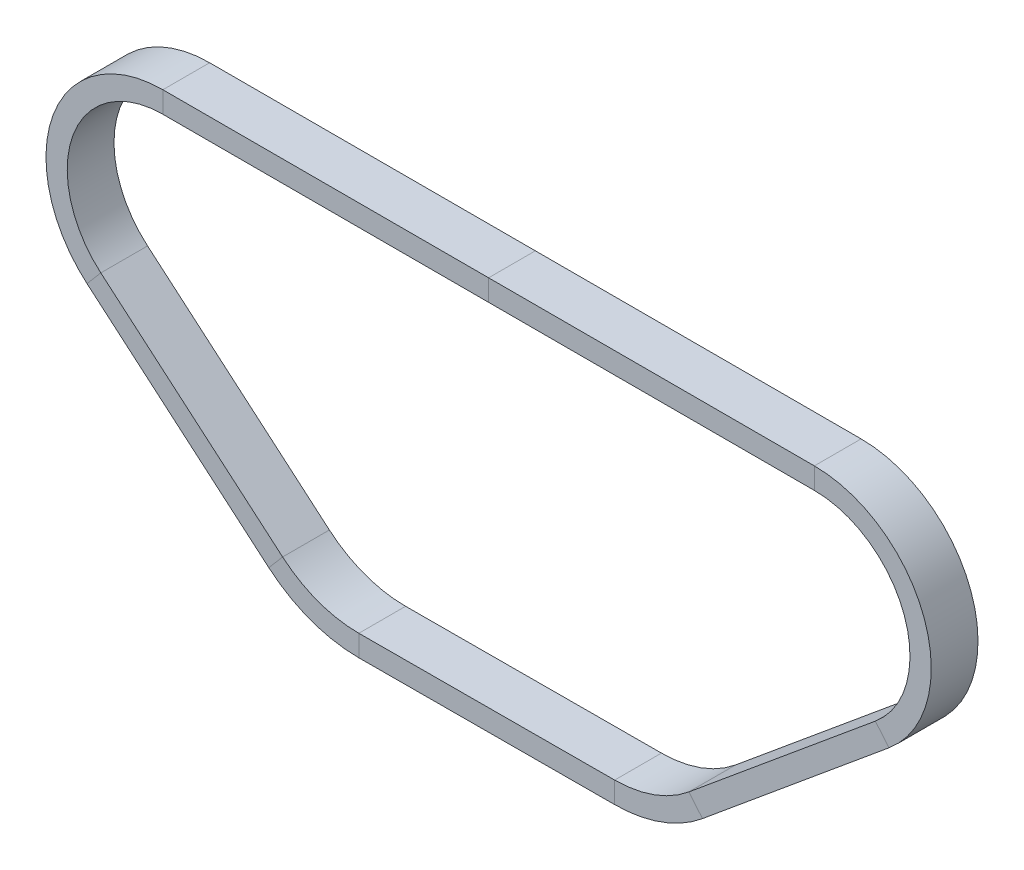
ISO-10303-21;
HEADER;
FILE_DESCRIPTION(('STEP AP214'),'2;1');
FILE_NAME('part.step','',(''),(''),'','','');
FILE_SCHEMA(('AUTOMOTIVE_DESIGN { 1 0 10303 214 1 1 1 1 }'));
ENDSEC;
DATA;
#1=APPLICATION_CONTEXT('core data for automotive mechanical design processes');
#2=APPLICATION_PROTOCOL_DEFINITION('international standard','automotive_design',2000,#1);
#3=PRODUCT_CONTEXT('',#1,'mechanical');
#4=PRODUCT('Part','Part','',(#3));
#5=PRODUCT_RELATED_PRODUCT_CATEGORY('part','',(#4));
#6=PRODUCT_DEFINITION_FORMATION('','',#4);
#7=PRODUCT_DEFINITION_CONTEXT('part definition',#1,'design');
#8=PRODUCT_DEFINITION('design','',#6,#7);
#9=PRODUCT_DEFINITION_SHAPE('','',#8);
#10=(LENGTH_UNIT() NAMED_UNIT(*) SI_UNIT(.MILLI.,.METRE.));
#11=(NAMED_UNIT(*) PLANE_ANGLE_UNIT() SI_UNIT($,.RADIAN.));
#12=(NAMED_UNIT(*) SI_UNIT($,.STERADIAN.) SOLID_ANGLE_UNIT());
#13=UNCERTAINTY_MEASURE_WITH_UNIT(LENGTH_MEASURE(1.E-05),#10,'distance_accuracy_value','');
#14=(GEOMETRIC_REPRESENTATION_CONTEXT(3) GLOBAL_UNCERTAINTY_ASSIGNED_CONTEXT((#13)) GLOBAL_UNIT_ASSIGNED_CONTEXT((#10,
#11,#12)) REPRESENTATION_CONTEXT('',''));
#15=CARTESIAN_POINT('',(0.,0.,0.));
#16=DIRECTION('',(0.,0.,1.));
#17=DIRECTION('',(1.,0.,0.));
#18=AXIS2_PLACEMENT_3D('',#15,#16,#17);
#19=CARTESIAN_POINT('',(766.320606961868,463.425171825375,55.));
#20=DIRECTION('',(0.,0.,-1.));
#21=DIRECTION('',(-1.,0.,0.));
#22=AXIS2_PLACEMENT_3D('',#19,#20,#21);
#23=PLANE('',#22);
#24=DIRECTION('',(0.,-1.,0.));
#25=VECTOR('',#24,1.);
#26=CARTESIAN_POINT('',(766.320606961868,463.425171825375,55.));
#27=LINE('',#26,#25);
#28=CARTESIAN_POINT('',(766.320606961868,463.425171825375,55.));
#29=VERTEX_POINT('',#28);
#30=CARTESIAN_POINT('',(766.320606961868,413.425171825375,55.));
#31=VERTEX_POINT('',#30);
#32=EDGE_CURVE('E215',#29,#31,#27,.T.);
#33=ORIENTED_EDGE('',*,*,#32,.F.);
#34=DIRECTION('',(-1.,0.,0.));
#35=VECTOR('',#34,1.);
#36=CARTESIAN_POINT('',(766.320606961868,463.425171825375,55.));
#37=LINE('',#36,#35);
#38=CARTESIAN_POINT('',(0.,463.425171825375,55.));
#39=VERTEX_POINT('',#38);
#40=EDGE_CURVE('E214',#29,#39,#37,.T.);
#41=ORIENTED_EDGE('',*,*,#40,.T.);
#42=DIRECTION('',(0.,-1.,0.));
#43=VECTOR('',#42,1.);
#44=CARTESIAN_POINT('',(0.,463.425171825375,55.));
#45=LINE('',#44,#43);
#46=CARTESIAN_POINT('',(0.,413.425171825375,55.));
#47=VERTEX_POINT('',#46);
#48=EDGE_CURVE('E189',#39,#47,#45,.T.);
#49=ORIENTED_EDGE('',*,*,#48,.T.);
#50=DIRECTION('',(-1.,0.,0.));
#51=VECTOR('',#50,1.);
#52=CARTESIAN_POINT('',(766.320606961868,413.425171825375,55.));
#53=LINE('',#52,#51);
#54=EDGE_CURVE('E219',#31,#47,#53,.T.);
#55=ORIENTED_EDGE('',*,*,#54,.F.);
#56=EDGE_LOOP('',(#33,#41,#49,#55));
#57=FACE_BOUND('',#56,.T.);
#58=ADVANCED_FACE('F33',(#57),#23,.F.);
#59=CARTESIAN_POINT('',(0.,463.425171825375,55.));
#60=DIRECTION('',(0.,0.,-1.));
#61=DIRECTION('',(-1.,0.,0.));
#62=AXIS2_PLACEMENT_3D('',#59,#60,#61);
#63=PLANE('',#62);
#64=DIRECTION('',(-1.,0.,0.));
#65=VECTOR('',#64,1.);
#66=CARTESIAN_POINT('',(0.,413.425171825375,55.));
#67=LINE('',#66,#65);
#68=CARTESIAN_POINT('',(-766.320606961868,413.425171825375,55.));
#69=VERTEX_POINT('',#68);
#70=EDGE_CURVE('E195',#47,#69,#67,.T.);
#71=ORIENTED_EDGE('',*,*,#70,.F.);
#72=ORIENTED_EDGE('',*,*,#48,.F.);
#73=DIRECTION('',(-1.,0.,0.));
#74=VECTOR('',#73,1.);
#75=CARTESIAN_POINT('',(0.,463.425171825375,55.));
#76=LINE('',#75,#74);
#77=CARTESIAN_POINT('',(-766.320606961868,463.425171825375,55.));
#78=VERTEX_POINT('',#77);
#79=EDGE_CURVE('E193',#39,#78,#76,.T.);
#80=ORIENTED_EDGE('',*,*,#79,.T.);
#81=DIRECTION('',(0.,-1.,0.));
#82=VECTOR('',#81,1.);
#83=CARTESIAN_POINT('',(-766.320606961868,463.425171825375,55.));
#84=LINE('',#83,#82);
#85=EDGE_CURVE('E211',#78,#69,#84,.T.);
#86=ORIENTED_EDGE('',*,*,#85,.T.);
#87=EDGE_LOOP('',(#71,#72,#80,#86));
#88=FACE_BOUND('',#87,.T.);
#89=ADVANCED_FACE('F191',(#88),#63,.F.);
#90=CARTESIAN_POINT('',(0.,413.425171825375,55.));
#91=DIRECTION('',(0.,1.,0.));
#92=DIRECTION('',(-1.,0.,0.));
#93=AXIS2_PLACEMENT_3D('',#90,#91,#92);
#94=PLANE('',#93);
#95=DIRECTION('',(-1.,0.,0.));
#96=VECTOR('',#95,1.);
#97=CARTESIAN_POINT('',(0.,413.425171825375,-55.));
#98=LINE('',#97,#96);
#99=CARTESIAN_POINT('',(0.,413.425171825375,-55.));
#100=VERTEX_POINT('',#99);
#101=CARTESIAN_POINT('',(-766.320606961868,413.425171825375,-55.));
#102=VERTEX_POINT('',#101);
#103=EDGE_CURVE('E276',#100,#102,#98,.T.);
#104=ORIENTED_EDGE('',*,*,#103,.F.);
#105=DIRECTION('',(0.,0.,-1.));
#106=VECTOR('',#105,1.);
#107=CARTESIAN_POINT('',(0.,413.425171825375,55.));
#108=LINE('',#107,#106);
#109=EDGE_CURVE('E200',#47,#100,#108,.T.);
#110=ORIENTED_EDGE('',*,*,#109,.F.);
#111=ORIENTED_EDGE('',*,*,#70,.T.);
#112=DIRECTION('',(0.,0.,-1.));
#113=VECTOR('',#112,1.);
#114=CARTESIAN_POINT('',(-766.320606961868,413.425171825375,55.));
#115=LINE('',#114,#113);
#116=EDGE_CURVE('E332',#69,#102,#115,.T.);
#117=ORIENTED_EDGE('',*,*,#116,.T.);
#118=EDGE_LOOP('',(#104,#110,#111,#117));
#119=FACE_BOUND('',#118,.T.);
#120=ADVANCED_FACE('F370',(#119),#94,.F.);
#121=CARTESIAN_POINT('',(0.,463.425171825375,-55.));
#122=DIRECTION('',(0.,0.,1.));
#123=DIRECTION('',(0.,-1.,0.));
#124=AXIS2_PLACEMENT_3D('',#121,#122,#123);
#125=PLANE('',#124);
#126=DIRECTION('',(-1.,0.,0.));
#127=VECTOR('',#126,1.);
#128=CARTESIAN_POINT('',(0.,463.425171825375,-55.));
#129=LINE('',#128,#127);
#130=CARTESIAN_POINT('',(0.,463.425171825375,-55.));
#131=VERTEX_POINT('',#130);
#132=CARTESIAN_POINT('',(-766.320606961868,463.425171825375,-55.));
#133=VERTEX_POINT('',#132);
#134=EDGE_CURVE('E230',#131,#133,#129,.T.);
#135=ORIENTED_EDGE('',*,*,#134,.F.);
#136=DIRECTION('',(0.,1.,0.));
#137=VECTOR('',#136,1.);
#138=CARTESIAN_POINT('',(0.,463.425171825375,-55.));
#139=LINE('',#138,#137);
#140=EDGE_CURVE('E222',#100,#131,#139,.T.);
#141=ORIENTED_EDGE('',*,*,#140,.F.);
#142=ORIENTED_EDGE('',*,*,#103,.T.);
#143=DIRECTION('',(0.,1.,0.));
#144=VECTOR('',#143,1.);
#145=CARTESIAN_POINT('',(-766.320606961868,463.425171825375,-55.));
#146=LINE('',#145,#144);
#147=EDGE_CURVE('E279',#102,#133,#146,.T.);
#148=ORIENTED_EDGE('',*,*,#147,.T.);
#149=EDGE_LOOP('',(#135,#141,#142,#148));
#150=FACE_BOUND('',#149,.T.);
#151=ADVANCED_FACE('F274',(#150),#125,.F.);
#152=CARTESIAN_POINT('',(0.,463.425171825375,55.));
#153=DIRECTION('',(0.,-1.,0.));
#154=DIRECTION('',(1.,0.,0.));
#155=AXIS2_PLACEMENT_3D('',#152,#153,#154);
#156=PLANE('',#155);
#157=DIRECTION('',(0.,0.,1.));
#158=VECTOR('',#157,1.);
#159=CARTESIAN_POINT('',(-766.320606961868,463.425171825375,55.));
#160=LINE('',#159,#158);
#161=EDGE_CURVE('E209',#133,#78,#160,.T.);
#162=ORIENTED_EDGE('',*,*,#161,.T.);
#163=ORIENTED_EDGE('',*,*,#79,.F.);
#164=DIRECTION('',(0.,0.,1.));
#165=VECTOR('',#164,1.);
#166=CARTESIAN_POINT('',(0.,463.425171825375,55.));
#167=LINE('',#166,#165);
#168=EDGE_CURVE('E207',#131,#39,#167,.T.);
#169=ORIENTED_EDGE('',*,*,#168,.F.);
#170=ORIENTED_EDGE('',*,*,#134,.T.);
#171=EDGE_LOOP('',(#162,#163,#169,#170));
#172=FACE_BOUND('',#171,.T.);
#173=ADVANCED_FACE('F205',(#172),#156,.F.);
#174=CARTESIAN_POINT('',(-766.320606961868,463.425171825375,55.));
#175=DIRECTION('',(0.,0.,-1.));
#176=DIRECTION('',(-1.,0.,0.));
#177=AXIS2_PLACEMENT_3D('',#174,#175,#176);
#178=PLANE('',#177);
#179=CARTESIAN_POINT('',(-766.320606961868,188.425171825375,55.));
#180=DIRECTION('',(0.,0.,1.));
#181=DIRECTION('',(0.,1.,0.));
#182=AXIS2_PLACEMENT_3D('',#179,#180,#181);
#183=CIRCLE('',#182,225.);
#184=CARTESIAN_POINT('',(-912.346371265804,17.2484322856477,55.));
#185=VERTEX_POINT('',#184);
#186=EDGE_CURVE('E338',#69,#185,#183,.T.);
#187=ORIENTED_EDGE('',*,*,#186,.F.);
#188=ORIENTED_EDGE('',*,*,#85,.F.);
#189=CARTESIAN_POINT('',(-766.320606961868,188.425171825375,55.));
#190=DIRECTION('',(0.,0.,1.));
#191=DIRECTION('',(0.,1.,0.));
#192=AXIS2_PLACEMENT_3D('',#189,#190,#191);
#193=CIRCLE('',#192,275.);
#194=CARTESIAN_POINT('',(-944.796541111123,-20.7908431676249,55.));
#195=VERTEX_POINT('',#194);
#196=EDGE_CURVE('E229',#78,#195,#193,.T.);
#197=ORIENTED_EDGE('',*,*,#196,.T.);
#198=DIRECTION('',(0.64900339690638,0.760785509065453,0.));
#199=VECTOR('',#198,1.);
#200=CARTESIAN_POINT('',(-944.796541111123,-20.7908431676249,55.));
#201=LINE('',#200,#199);
#202=EDGE_CURVE('E388',#195,#185,#201,.T.);
#203=ORIENTED_EDGE('',*,*,#202,.T.);
#204=EDGE_LOOP('',(#187,#188,#197,#203));
#205=FACE_BOUND('',#204,.T.);
#206=ADVANCED_FACE('F458',(#205),#178,.F.);
#207=CARTESIAN_POINT('',(-766.320606961868,188.425171825375,0.));
#208=DIRECTION('',(0.,0.,1.));
#209=DIRECTION('',(1.,0.,0.));
#210=AXIS2_PLACEMENT_3D('',#207,#208,#209);
#211=CYLINDRICAL_SURFACE('',#210,225.);
#212=CARTESIAN_POINT('',(-766.320606961868,188.425171825375,-55.));
#213=DIRECTION('',(0.,0.,1.));
#214=DIRECTION('',(0.,1.,0.));
#215=AXIS2_PLACEMENT_3D('',#212,#213,#214);
#216=CIRCLE('',#215,225.);
#217=CARTESIAN_POINT('',(-912.346371265804,17.2484322856477,-55.));
#218=VERTEX_POINT('',#217);
#219=EDGE_CURVE('E287',#102,#218,#216,.T.);
#220=ORIENTED_EDGE('',*,*,#219,.F.);
#221=ORIENTED_EDGE('',*,*,#116,.F.);
#222=ORIENTED_EDGE('',*,*,#186,.T.);
#223=DIRECTION('',(0.,0.,-1.));
#224=VECTOR('',#223,1.);
#225=CARTESIAN_POINT('',(-912.346371265804,17.2484322856477,55.));
#226=LINE('',#225,#224);
#227=EDGE_CURVE('E335',#185,#218,#226,.T.);
#228=ORIENTED_EDGE('',*,*,#227,.T.);
#229=EDGE_LOOP('',(#220,#221,#222,#228));
#230=FACE_BOUND('',#229,.T.);
#231=ADVANCED_FACE('F374',(#230),#211,.F.);
#232=CARTESIAN_POINT('',(-766.320606961868,463.425171825375,-55.));
#233=DIRECTION('',(0.,0.,1.));
#234=DIRECTION('',(1.,0.,0.));
#235=AXIS2_PLACEMENT_3D('',#232,#233,#234);
#236=PLANE('',#235);
#237=CARTESIAN_POINT('',(-766.320606961868,188.425171825375,-55.));
#238=DIRECTION('',(0.,0.,1.));
#239=DIRECTION('',(0.,1.,0.));
#240=AXIS2_PLACEMENT_3D('',#237,#238,#239);
#241=CIRCLE('',#240,275.);
#242=CARTESIAN_POINT('',(-944.796541111123,-20.7908431676249,-55.));
#243=VERTEX_POINT('',#242);
#244=EDGE_CURVE('E235',#133,#243,#241,.T.);
#245=ORIENTED_EDGE('',*,*,#244,.F.);
#246=ORIENTED_EDGE('',*,*,#147,.F.);
#247=ORIENTED_EDGE('',*,*,#219,.T.);
#248=DIRECTION('',(-0.64900339690638,-0.760785509065453,0.));
#249=VECTOR('',#248,1.);
#250=CARTESIAN_POINT('',(-944.796541111123,-20.7908431676249,-55.));
#251=LINE('',#250,#249);
#252=EDGE_CURVE('E284',#218,#243,#251,.T.);
#253=ORIENTED_EDGE('',*,*,#252,.T.);
#254=EDGE_LOOP('',(#245,#246,#247,#253));
#255=FACE_BOUND('',#254,.T.);
#256=ADVANCED_FACE('F378',(#255),#236,.F.);
#257=CARTESIAN_POINT('',(-766.320606961868,188.425171825375,0.));
#258=DIRECTION('',(0.,0.,1.));
#259=DIRECTION('',(1.,0.,0.));
#260=AXIS2_PLACEMENT_3D('',#257,#258,#259);
#261=CYLINDRICAL_SURFACE('',#260,275.);
#262=DIRECTION('',(0.,0.,1.));
#263=VECTOR('',#262,1.);
#264=CARTESIAN_POINT('',(-944.796541111123,-20.7908431676249,55.));
#265=LINE('',#264,#263);
#266=EDGE_CURVE('E231',#243,#195,#265,.T.);
#267=ORIENTED_EDGE('',*,*,#266,.T.);
#268=ORIENTED_EDGE('',*,*,#196,.F.);
#269=ORIENTED_EDGE('',*,*,#161,.F.);
#270=ORIENTED_EDGE('',*,*,#244,.T.);
#271=EDGE_LOOP('',(#267,#268,#269,#270));
#272=FACE_BOUND('',#271,.T.);
#273=ADVANCED_FACE('F382',(#272),#261,.T.);
#274=CARTESIAN_POINT('',(-944.796541111123,-20.7908431676249,55.));
#275=DIRECTION('',(0.,0.,-1.));
#276=DIRECTION('',(-1.,0.,0.));
#277=AXIS2_PLACEMENT_3D('',#274,#275,#276);
#278=PLANE('',#277);
#279=DIRECTION('',(0.760785509065453,-0.64900339690638,0.));
#280=VECTOR('',#279,1.);
#281=CARTESIAN_POINT('',(-912.346371265804,17.2484322856477,55.));
#282=LINE('',#281,#280);
#283=CARTESIAN_POINT('',(-484.609419585723,-347.641186818374,55.));
#284=VERTEX_POINT('',#283);
#285=EDGE_CURVE('E343',#185,#284,#282,.T.);
#286=ORIENTED_EDGE('',*,*,#285,.F.);
#287=ORIENTED_EDGE('',*,*,#202,.F.);
#288=DIRECTION('',(0.760785509065453,-0.64900339690638,0.));
#289=VECTOR('',#288,1.);
#290=CARTESIAN_POINT('',(-944.796541111123,-20.7908431676249,55.));
#291=LINE('',#290,#289);
#292=CARTESIAN_POINT('',(-517.059589431042,-385.680462271647,55.));
#293=VERTEX_POINT('',#292);
#294=EDGE_CURVE('E234',#195,#293,#291,.T.);
#295=ORIENTED_EDGE('',*,*,#294,.T.);
#296=DIRECTION('',(0.64900339690638,0.760785509065453,0.));
#297=VECTOR('',#296,1.);
#298=CARTESIAN_POINT('',(-517.059589431042,-385.680462271647,55.));
#299=LINE('',#298,#297);
#300=EDGE_CURVE('E393',#293,#284,#299,.T.);
#301=ORIENTED_EDGE('',*,*,#300,.T.);
#302=EDGE_LOOP('',(#286,#287,#295,#301));
#303=FACE_BOUND('',#302,.T.);
#304=ADVANCED_FACE('F456',(#303),#278,.F.);
#305=CARTESIAN_POINT('',(-912.346371265804,17.2484322856477,55.));
#306=DIRECTION('',(-0.64900339690638,-0.760785509065453,0.));
#307=DIRECTION('',(0.760785509065453,-0.64900339690638,0.));
#308=AXIS2_PLACEMENT_3D('',#305,#306,#307);
#309=PLANE('',#308);
#310=DIRECTION('',(0.760785509065453,-0.64900339690638,0.));
#311=VECTOR('',#310,1.);
#312=CARTESIAN_POINT('',(-912.346371265804,17.2484322856477,-55.));
#313=LINE('',#312,#311);
#314=CARTESIAN_POINT('',(-484.609419585723,-347.641186818374,-55.));
#315=VERTEX_POINT('',#314);
#316=EDGE_CURVE('E292',#218,#315,#313,.T.);
#317=ORIENTED_EDGE('',*,*,#316,.F.);
#318=ORIENTED_EDGE('',*,*,#227,.F.);
#319=ORIENTED_EDGE('',*,*,#285,.T.);
#320=DIRECTION('',(0.,0.,-1.));
#321=VECTOR('',#320,1.);
#322=CARTESIAN_POINT('',(-484.609419585723,-347.641186818374,55.));
#323=LINE('',#322,#321);
#324=EDGE_CURVE('E340',#284,#315,#323,.T.);
#325=ORIENTED_EDGE('',*,*,#324,.T.);
#326=EDGE_LOOP('',(#317,#318,#319,#325));
#327=FACE_BOUND('',#326,.T.);
#328=ADVANCED_FACE('F455',(#327),#309,.F.);
#329=CARTESIAN_POINT('',(-944.796541111123,-20.7908431676249,-55.));
#330=DIRECTION('',(0.,0.,1.));
#331=DIRECTION('',(0.,-1.,0.));
#332=AXIS2_PLACEMENT_3D('',#329,#330,#331);
#333=PLANE('',#332);
#334=DIRECTION('',(0.760785509065453,-0.64900339690638,0.));
#335=VECTOR('',#334,1.);
#336=CARTESIAN_POINT('',(-944.796541111123,-20.7908431676249,-55.));
#337=LINE('',#336,#335);
#338=CARTESIAN_POINT('',(-517.059589431042,-385.680462271647,-55.));
#339=VERTEX_POINT('',#338);
#340=EDGE_CURVE('E240',#243,#339,#337,.T.);
#341=ORIENTED_EDGE('',*,*,#340,.F.);
#342=ORIENTED_EDGE('',*,*,#252,.F.);
#343=ORIENTED_EDGE('',*,*,#316,.T.);
#344=DIRECTION('',(-0.64900339690638,-0.760785509065453,0.));
#345=VECTOR('',#344,1.);
#346=CARTESIAN_POINT('',(-517.059589431042,-385.680462271647,-55.));
#347=LINE('',#346,#345);
#348=EDGE_CURVE('E289',#315,#339,#347,.T.);
#349=ORIENTED_EDGE('',*,*,#348,.T.);
#350=EDGE_LOOP('',(#341,#342,#343,#349));
#351=FACE_BOUND('',#350,.T.);
#352=ADVANCED_FACE('F453',(#351),#333,.F.);
#353=CARTESIAN_POINT('',(-944.796541111123,-20.7908431676249,55.));
#354=DIRECTION('',(0.64900339690638,0.760785509065453,0.));
#355=DIRECTION('',(-0.760785509065453,0.64900339690638,0.));
#356=AXIS2_PLACEMENT_3D('',#353,#354,#355);
#357=PLANE('',#356);
#358=DIRECTION('',(0.,0.,1.));
#359=VECTOR('',#358,1.);
#360=CARTESIAN_POINT('',(-517.059589431042,-385.680462271647,55.));
#361=LINE('',#360,#359);
#362=EDGE_CURVE('E236',#339,#293,#361,.T.);
#363=ORIENTED_EDGE('',*,*,#362,.T.);
#364=ORIENTED_EDGE('',*,*,#294,.F.);
#365=ORIENTED_EDGE('',*,*,#266,.F.);
#366=ORIENTED_EDGE('',*,*,#340,.T.);
#367=EDGE_LOOP('',(#363,#364,#365,#366));
#368=FACE_BOUND('',#367,.T.);
#369=ADVANCED_FACE('F451',(#368),#357,.F.);
#370=CARTESIAN_POINT('',(-517.059589431042,-385.680462271647,55.));
#371=DIRECTION('',(0.,0.,-1.));
#372=DIRECTION('',(-1.,0.,0.));
#373=AXIS2_PLACEMENT_3D('',#370,#371,#372);
#374=PLANE('',#373);
#375=CARTESIAN_POINT('',(-306.133485436468,-138.425171825375,55.));
#376=DIRECTION('',(0.,0.,1.));
#377=DIRECTION('',(-0.649003396906381,-0.760785509065452,0.));
#378=AXIS2_PLACEMENT_3D('',#375,#376,#377);
#379=CIRCLE('',#378,275.);
#380=CARTESIAN_POINT('',(-305.293587218961,-413.423889224173,55.));
#381=VERTEX_POINT('',#380);
#382=EDGE_CURVE('E348',#284,#381,#379,.T.);
#383=ORIENTED_EDGE('',*,*,#382,.F.);
#384=ORIENTED_EDGE('',*,*,#300,.F.);
#385=CARTESIAN_POINT('',(-306.133485436468,-138.425171825375,55.));
#386=DIRECTION('',(0.,0.,1.));
#387=DIRECTION('',(-0.649003396906381,-0.760785509065452,0.));
#388=AXIS2_PLACEMENT_3D('',#385,#386,#387);
#389=CIRCLE('',#388,325.);
#390=CARTESIAN_POINT('',(-305.140878452141,-463.423656023955,55.));
#391=VERTEX_POINT('',#390);
#392=EDGE_CURVE('E239',#293,#391,#389,.T.);
#393=ORIENTED_EDGE('',*,*,#392,.T.);
#394=DIRECTION('',(-0.00305417533639123,0.999995335995631,0.));
#395=VECTOR('',#394,1.);
#396=CARTESIAN_POINT('',(-305.140878452141,-463.423656023955,55.));
#397=LINE('',#396,#395);
#398=EDGE_CURVE('E398',#391,#381,#397,.T.);
#399=ORIENTED_EDGE('',*,*,#398,.T.);
#400=EDGE_LOOP('',(#383,#384,#393,#399));
#401=FACE_BOUND('',#400,.T.);
#402=ADVANCED_FACE('F447',(#401),#374,.F.);
#403=CARTESIAN_POINT('',(-306.133485436468,-138.425171825375,0.));
#404=DIRECTION('',(0.,0.,1.));
#405=DIRECTION('',(1.,0.,0.));
#406=AXIS2_PLACEMENT_3D('',#403,#404,#405);
#407=CYLINDRICAL_SURFACE('',#406,275.);
#408=CARTESIAN_POINT('',(-306.133485436468,-138.425171825375,-55.));
#409=DIRECTION('',(0.,0.,1.));
#410=DIRECTION('',(-0.649003396906381,-0.760785509065452,0.));
#411=AXIS2_PLACEMENT_3D('',#408,#409,#410);
#412=CIRCLE('',#411,275.);
#413=CARTESIAN_POINT('',(-305.293587218961,-413.423889224173,-55.));
#414=VERTEX_POINT('',#413);
#415=EDGE_CURVE('E297',#315,#414,#412,.T.);
#416=ORIENTED_EDGE('',*,*,#415,.F.);
#417=ORIENTED_EDGE('',*,*,#324,.F.);
#418=ORIENTED_EDGE('',*,*,#382,.T.);
#419=DIRECTION('',(0.,0.,-1.));
#420=VECTOR('',#419,1.);
#421=CARTESIAN_POINT('',(-305.293587218961,-413.423889224173,55.));
#422=LINE('',#421,#420);
#423=EDGE_CURVE('E345',#381,#414,#422,.T.);
#424=ORIENTED_EDGE('',*,*,#423,.T.);
#425=EDGE_LOOP('',(#416,#417,#418,#424));
#426=FACE_BOUND('',#425,.T.);
#427=ADVANCED_FACE('F443',(#426),#407,.F.);
#428=CARTESIAN_POINT('',(-517.059589431042,-385.680462271647,-55.));
#429=DIRECTION('',(0.,0.,1.));
#430=DIRECTION('',(1.,0.,0.));
#431=AXIS2_PLACEMENT_3D('',#428,#429,#430);
#432=PLANE('',#431);
#433=CARTESIAN_POINT('',(-306.133485436468,-138.425171825375,-55.));
#434=DIRECTION('',(0.,0.,1.));
#435=DIRECTION('',(-0.649003396906381,-0.760785509065452,0.));
#436=AXIS2_PLACEMENT_3D('',#433,#434,#435);
#437=CIRCLE('',#436,325.);
#438=CARTESIAN_POINT('',(-305.140878452141,-463.423656023955,-55.));
#439=VERTEX_POINT('',#438);
#440=EDGE_CURVE('E245',#339,#439,#437,.T.);
#441=ORIENTED_EDGE('',*,*,#440,.F.);
#442=ORIENTED_EDGE('',*,*,#348,.F.);
#443=ORIENTED_EDGE('',*,*,#415,.T.);
#444=DIRECTION('',(0.00305417533639123,-0.999995335995631,0.));
#445=VECTOR('',#444,1.);
#446=CARTESIAN_POINT('',(-305.140878452141,-463.423656023955,-55.));
#447=LINE('',#446,#445);
#448=EDGE_CURVE('E294',#414,#439,#447,.T.);
#449=ORIENTED_EDGE('',*,*,#448,.T.);
#450=EDGE_LOOP('',(#441,#442,#443,#449));
#451=FACE_BOUND('',#450,.T.);
#452=ADVANCED_FACE('F439',(#451),#432,.F.);
#453=CARTESIAN_POINT('',(-306.133485436468,-138.425171825375,0.));
#454=DIRECTION('',(0.,0.,1.));
#455=DIRECTION('',(1.,0.,0.));
#456=AXIS2_PLACEMENT_3D('',#453,#454,#455);
#457=CYLINDRICAL_SURFACE('',#456,325.);
#458=DIRECTION('',(0.,0.,1.));
#459=VECTOR('',#458,1.);
#460=CARTESIAN_POINT('',(-305.140878452141,-463.423656023955,55.));
#461=LINE('',#460,#459);
#462=EDGE_CURVE('E241',#439,#391,#461,.T.);
#463=ORIENTED_EDGE('',*,*,#462,.T.);
#464=ORIENTED_EDGE('',*,*,#392,.F.);
#465=ORIENTED_EDGE('',*,*,#362,.F.);
#466=ORIENTED_EDGE('',*,*,#440,.T.);
#467=EDGE_LOOP('',(#463,#464,#465,#466));
#468=FACE_BOUND('',#467,.T.);
#469=ADVANCED_FACE('F434',(#468),#457,.T.);
#470=CARTESIAN_POINT('',(-305.140878452141,-463.423656023955,55.));
#471=DIRECTION('',(0.,0.,-1.));
#472=DIRECTION('',(-1.,0.,0.));
#473=AXIS2_PLACEMENT_3D('',#470,#471,#472);
#474=PLANE('',#473);
#475=DIRECTION('',(0.999995335995631,0.0030541753363919,0.));
#476=VECTOR('',#475,1.);
#477=CARTESIAN_POINT('',(-305.293587218961,-413.423889224173,55.));
#478=LINE('',#477,#476);
#479=CARTESIAN_POINT('',(296.584695505146,-411.58563884396,55.));
#480=VERTEX_POINT('',#479);
#481=EDGE_CURVE('E353',#381,#480,#478,.T.);
#482=ORIENTED_EDGE('',*,*,#481,.F.);
#483=ORIENTED_EDGE('',*,*,#398,.F.);
#484=DIRECTION('',(0.999995335995631,0.0030541753363919,0.));
#485=VECTOR('',#484,1.);
#486=CARTESIAN_POINT('',(-305.140878452141,-463.423656023955,55.));
#487=LINE('',#486,#485);
#488=CARTESIAN_POINT('',(296.737404271965,-461.585405643741,55.));
#489=VERTEX_POINT('',#488);
#490=EDGE_CURVE('E244',#391,#489,#487,.T.);
#491=ORIENTED_EDGE('',*,*,#490,.T.);
#492=DIRECTION('',(-0.00305417533639168,0.999995335995631,0.));
#493=VECTOR('',#492,1.);
#494=CARTESIAN_POINT('',(296.737404271965,-461.585405643741,55.));
#495=LINE('',#494,#493);
#496=EDGE_CURVE('E304',#489,#480,#495,.T.);
#497=ORIENTED_EDGE('',*,*,#496,.T.);
#498=EDGE_LOOP('',(#482,#483,#491,#497));
#499=FACE_BOUND('',#498,.T.);
#500=ADVANCED_FACE('F428',(#499),#474,.F.);
#501=CARTESIAN_POINT('',(-305.293587218961,-413.423889224173,55.));
#502=DIRECTION('',(0.0030541753363919,-0.999995335995631,0.));
#503=DIRECTION('',(0.999995335995631,0.0030541753363919,0.));
#504=AXIS2_PLACEMENT_3D('',#501,#502,#503);
#505=PLANE('',#504);
#506=DIRECTION('',(0.999995335995631,0.0030541753363919,0.));
#507=VECTOR('',#506,1.);
#508=CARTESIAN_POINT('',(-305.293587218961,-413.423889224173,-55.));
#509=LINE('',#508,#507);
#510=CARTESIAN_POINT('',(296.584695505146,-411.58563884396,-55.));
#511=VERTEX_POINT('',#510);
#512=EDGE_CURVE('E305',#414,#511,#509,.T.);
#513=ORIENTED_EDGE('',*,*,#512,.F.);
#514=ORIENTED_EDGE('',*,*,#423,.F.);
#515=ORIENTED_EDGE('',*,*,#481,.T.);
#516=DIRECTION('',(0.,0.,-1.));
#517=VECTOR('',#516,1.);
#518=CARTESIAN_POINT('',(296.584695505146,-411.58563884396,55.));
#519=LINE('',#518,#517);
#520=EDGE_CURVE('E301',#480,#511,#519,.T.);
#521=ORIENTED_EDGE('',*,*,#520,.T.);
#522=EDGE_LOOP('',(#513,#514,#515,#521));
#523=FACE_BOUND('',#522,.T.);
#524=ADVANCED_FACE('F424',(#523),#505,.F.);
#525=CARTESIAN_POINT('',(-305.140878452141,-463.423656023955,-55.));
#526=DIRECTION('',(0.,0.,1.));
#527=DIRECTION('',(0.,-1.,0.));
#528=AXIS2_PLACEMENT_3D('',#525,#526,#527);
#529=PLANE('',#528);
#530=DIRECTION('',(0.999995335995631,0.0030541753363919,0.));
#531=VECTOR('',#530,1.);
#532=CARTESIAN_POINT('',(-305.140878452141,-463.423656023955,-55.));
#533=LINE('',#532,#531);
#534=CARTESIAN_POINT('',(296.737404271965,-461.585405643741,-55.));
#535=VERTEX_POINT('',#534);
#536=EDGE_CURVE('E302',#439,#535,#533,.T.);
#537=ORIENTED_EDGE('',*,*,#536,.F.);
#538=ORIENTED_EDGE('',*,*,#448,.F.);
#539=ORIENTED_EDGE('',*,*,#512,.T.);
#540=DIRECTION('',(0.00305417533639168,-0.999995335995631,0.));
#541=VECTOR('',#540,1.);
#542=CARTESIAN_POINT('',(296.737404271965,-461.585405643741,-55.));
#543=LINE('',#542,#541);
#544=EDGE_CURVE('E250',#511,#535,#543,.T.);
#545=ORIENTED_EDGE('',*,*,#544,.T.);
#546=EDGE_LOOP('',(#537,#538,#539,#545));
#547=FACE_BOUND('',#546,.T.);
#548=ADVANCED_FACE('F418',(#547),#529,.F.);
#549=CARTESIAN_POINT('',(-305.140878452141,-463.423656023955,55.));
#550=DIRECTION('',(-0.0030541753363919,0.999995335995631,0.));
#551=DIRECTION('',(-0.999995335995631,-0.0030541753363919,0.));
#552=AXIS2_PLACEMENT_3D('',#549,#550,#551);
#553=PLANE('',#552);
#554=DIRECTION('',(0.,0.,1.));
#555=VECTOR('',#554,1.);
#556=CARTESIAN_POINT('',(296.737404271965,-461.585405643741,55.));
#557=LINE('',#556,#555);
#558=EDGE_CURVE('E246',#535,#489,#557,.T.);
#559=ORIENTED_EDGE('',*,*,#558,.T.);
#560=ORIENTED_EDGE('',*,*,#490,.F.);
#561=ORIENTED_EDGE('',*,*,#462,.F.);
#562=ORIENTED_EDGE('',*,*,#536,.T.);
#563=EDGE_LOOP('',(#559,#560,#561,#562));
#564=FACE_BOUND('',#563,.T.);
#565=ADVANCED_FACE('F431',(#564),#553,.F.);
#566=CARTESIAN_POINT('',(296.737404271965,-461.585405643741,55.));
#567=DIRECTION('',(0.,0.,-1.));
#568=DIRECTION('',(-1.,0.,0.));
#569=AXIS2_PLACEMENT_3D('',#566,#567,#568);
#570=PLANE('',#569);
#571=CARTESIAN_POINT('',(295.744797287638,-136.586921445161,55.));
#572=DIRECTION('',(0.,0.,1.));
#573=DIRECTION('',(0.00305417533639138,-0.999995335995631,0.));
#574=AXIS2_PLACEMENT_3D('',#571,#572,#573);
#575=CIRCLE('',#574,275.);
#576=CARTESIAN_POINT('',(471.211063423808,-348.333443136146,55.));
#577=VERTEX_POINT('',#576);
#578=EDGE_CURVE('E158',#480,#577,#575,.T.);
#579=ORIENTED_EDGE('',*,*,#578,.F.);
#580=ORIENTED_EDGE('',*,*,#496,.F.);
#581=CARTESIAN_POINT('',(295.744797287638,-136.586921445161,55.));
#582=DIRECTION('',(0.,0.,1.));
#583=DIRECTION('',(0.00305417533639133,-0.999995335995631,0.));
#584=AXIS2_PLACEMENT_3D('',#581,#582,#583);
#585=CIRCLE('',#584,325.);
#586=CARTESIAN_POINT('',(503.114020903112,-386.832810716325,55.));
#587=VERTEX_POINT('',#586);
#588=EDGE_CURVE('E249',#489,#587,#585,.T.);
#589=ORIENTED_EDGE('',*,*,#588,.T.);
#590=DIRECTION('',(-0.638059149586072,0.769987351603582,0.));
#591=VECTOR('',#590,1.);
#592=CARTESIAN_POINT('',(503.114020903112,-386.832810716325,55.));
#593=LINE('',#592,#591);
#594=EDGE_CURVE('E407',#587,#577,#593,.T.);
#595=ORIENTED_EDGE('',*,*,#594,.T.);
#596=EDGE_LOOP('',(#579,#580,#589,#595));
#597=FACE_BOUND('',#596,.T.);
#598=ADVANCED_FACE('F412',(#597),#570,.F.);
#599=CARTESIAN_POINT('',(295.744797287638,-136.586921445161,0.));
#600=DIRECTION('',(0.,0.,1.));
#601=DIRECTION('',(1.,0.,0.));
#602=AXIS2_PLACEMENT_3D('',#599,#600,#601);
#603=CYLINDRICAL_SURFACE('',#602,275.);
#604=CARTESIAN_POINT('',(295.744797287638,-136.586921445161,-55.));
#605=DIRECTION('',(0.,0.,1.));
#606=DIRECTION('',(0.00305417533639138,-0.999995335995631,0.));
#607=AXIS2_PLACEMENT_3D('',#604,#605,#606);
#608=CIRCLE('',#607,275.);
#609=CARTESIAN_POINT('',(471.211063423808,-348.333443136146,-55.));
#610=VERTEX_POINT('',#609);
#611=EDGE_CURVE('E152',#511,#610,#608,.T.);
#612=ORIENTED_EDGE('',*,*,#611,.F.);
#613=ORIENTED_EDGE('',*,*,#520,.F.);
#614=ORIENTED_EDGE('',*,*,#578,.T.);
#615=DIRECTION('',(0.,0.,-1.));
#616=VECTOR('',#615,1.);
#617=CARTESIAN_POINT('',(471.211063423808,-348.333443136146,55.));
#618=LINE('',#617,#616);
#619=EDGE_CURVE('E354',#577,#610,#618,.T.);
#620=ORIENTED_EDGE('',*,*,#619,.T.);
#621=EDGE_LOOP('',(#612,#613,#614,#620));
#622=FACE_BOUND('',#621,.T.);
#623=ADVANCED_FACE('F415',(#622),#603,.F.);
#624=CARTESIAN_POINT('',(296.737404271965,-461.585405643741,-55.));
#625=DIRECTION('',(0.,0.,1.));
#626=DIRECTION('',(1.,0.,0.));
#627=AXIS2_PLACEMENT_3D('',#624,#625,#626);
#628=PLANE('',#627);
#629=CARTESIAN_POINT('',(295.744797287638,-136.586921445161,-55.));
#630=DIRECTION('',(0.,0.,1.));
#631=DIRECTION('',(0.00305417533639133,-0.999995335995631,0.));
#632=AXIS2_PLACEMENT_3D('',#629,#630,#631);
#633=CIRCLE('',#632,325.);
#634=CARTESIAN_POINT('',(503.114020903112,-386.832810716325,-55.));
#635=VERTEX_POINT('',#634);
#636=EDGE_CURVE('E254',#535,#635,#633,.T.);
#637=ORIENTED_EDGE('',*,*,#636,.F.);
#638=ORIENTED_EDGE('',*,*,#544,.F.);
#639=ORIENTED_EDGE('',*,*,#611,.T.);
#640=DIRECTION('',(0.638059149586072,-0.769987351603582,0.));
#641=VECTOR('',#640,1.);
#642=CARTESIAN_POINT('',(503.114020903112,-386.832810716325,-55.));
#643=LINE('',#642,#641);
#644=EDGE_CURVE('E306',#610,#635,#643,.T.);
#645=ORIENTED_EDGE('',*,*,#644,.T.);
#646=EDGE_LOOP('',(#637,#638,#639,#645));
#647=FACE_BOUND('',#646,.T.);
#648=ADVANCED_FACE('F312',(#647),#628,.F.);
#649=CARTESIAN_POINT('',(295.744797287638,-136.586921445161,0.));
#650=DIRECTION('',(0.,0.,1.));
#651=DIRECTION('',(1.,0.,0.));
#652=AXIS2_PLACEMENT_3D('',#649,#650,#651);
#653=CYLINDRICAL_SURFACE('',#652,325.);
#654=DIRECTION('',(0.,0.,1.));
#655=VECTOR('',#654,1.);
#656=CARTESIAN_POINT('',(503.114020903112,-386.832810716325,55.));
#657=LINE('',#656,#655);
#658=EDGE_CURVE('E251',#635,#587,#657,.T.);
#659=ORIENTED_EDGE('',*,*,#658,.T.);
#660=ORIENTED_EDGE('',*,*,#588,.F.);
#661=ORIENTED_EDGE('',*,*,#558,.F.);
#662=ORIENTED_EDGE('',*,*,#636,.T.);
#663=EDGE_LOOP('',(#659,#660,#661,#662));
#664=FACE_BOUND('',#663,.T.);
#665=ADVANCED_FACE('F310',(#664),#653,.T.);
#666=CARTESIAN_POINT('',(503.114020903112,-386.832810716325,55.));
#667=DIRECTION('',(0.,0.,-1.));
#668=DIRECTION('',(-1.,0.,0.));
#669=AXIS2_PLACEMENT_3D('',#666,#667,#668);
#670=PLANE('',#669);
#671=DIRECTION('',(0.769987351603582,0.638059149586072,0.));
#672=VECTOR('',#671,1.);
#673=CARTESIAN_POINT('',(471.211063423808,-348.333443136146,55.));
#674=LINE('',#673,#672);
#675=CARTESIAN_POINT('',(909.883915618734,15.178017714569,55.));
#676=VERTEX_POINT('',#675);
#677=EDGE_CURVE('E123',#577,#676,#674,.T.);
#678=ORIENTED_EDGE('',*,*,#677,.F.);
#679=ORIENTED_EDGE('',*,*,#594,.F.);
#680=DIRECTION('',(0.769987351603582,0.638059149586072,0.));
#681=VECTOR('',#680,1.);
#682=CARTESIAN_POINT('',(503.114020903112,-386.832810716325,55.));
#683=LINE('',#682,#681);
#684=CARTESIAN_POINT('',(941.786873098038,-23.3213498656101,55.));
#685=VERTEX_POINT('',#684);
#686=EDGE_CURVE('E253',#587,#685,#683,.T.);
#687=ORIENTED_EDGE('',*,*,#686,.T.);
#688=DIRECTION('',(-0.638059149586072,0.769987351603582,0.));
#689=VECTOR('',#688,1.);
#690=CARTESIAN_POINT('',(941.786873098038,-23.3213498656101,55.));
#691=LINE('',#690,#689);
#692=EDGE_CURVE('E318',#685,#676,#691,.T.);
#693=ORIENTED_EDGE('',*,*,#692,.T.);
#694=EDGE_LOOP('',(#678,#679,#687,#693));
#695=FACE_BOUND('',#694,.T.);
#696=ADVANCED_FACE('F413',(#695),#670,.F.);
#697=CARTESIAN_POINT('',(471.211063423808,-348.333443136146,55.));
#698=DIRECTION('',(0.638059149586072,-0.769987351603582,0.));
#699=DIRECTION('',(0.769987351603582,0.638059149586072,0.));
#700=AXIS2_PLACEMENT_3D('',#697,#698,#699);
#701=PLANE('',#700);
#702=DIRECTION('',(0.769987351603582,0.638059149586072,0.));
#703=VECTOR('',#702,1.);
#704=CARTESIAN_POINT('',(471.211063423808,-348.333443136146,-55.));
#705=LINE('',#704,#703);
#706=CARTESIAN_POINT('',(909.883915618734,15.178017714569,-55.));
#707=VERTEX_POINT('',#706);
#708=EDGE_CURVE('E116',#610,#707,#705,.T.);
#709=ORIENTED_EDGE('',*,*,#708,.F.);
#710=ORIENTED_EDGE('',*,*,#619,.F.);
#711=ORIENTED_EDGE('',*,*,#677,.T.);
#712=DIRECTION('',(0.,0.,-1.));
#713=VECTOR('',#712,1.);
#714=CARTESIAN_POINT('',(909.883915618734,15.1780177145689,55.));
#715=LINE('',#714,#713);
#716=EDGE_CURVE('E357',#676,#707,#715,.T.);
#717=ORIENTED_EDGE('',*,*,#716,.T.);
#718=EDGE_LOOP('',(#709,#710,#711,#717));
#719=FACE_BOUND('',#718,.T.);
#720=ADVANCED_FACE('F414',(#719),#701,.F.);
#721=CARTESIAN_POINT('',(503.114020903112,-386.832810716325,-55.));
#722=DIRECTION('',(0.,0.,1.));
#723=DIRECTION('',(0.,-1.,0.));
#724=AXIS2_PLACEMENT_3D('',#721,#722,#723);
#725=PLANE('',#724);
#726=DIRECTION('',(0.769987351603582,0.638059149586072,0.));
#727=VECTOR('',#726,1.);
#728=CARTESIAN_POINT('',(503.114020903112,-386.832810716325,-55.));
#729=LINE('',#728,#727);
#730=CARTESIAN_POINT('',(941.786873098038,-23.3213498656101,-55.));
#731=VERTEX_POINT('',#730);
#732=EDGE_CURVE('E107',#635,#731,#729,.T.);
#733=ORIENTED_EDGE('',*,*,#732,.F.);
#734=ORIENTED_EDGE('',*,*,#644,.F.);
#735=ORIENTED_EDGE('',*,*,#708,.T.);
#736=DIRECTION('',(0.638059149586072,-0.769987351603582,0.));
#737=VECTOR('',#736,1.);
#738=CARTESIAN_POINT('',(941.786873098038,-23.3213498656101,-55.));
#739=LINE('',#738,#737);
#740=EDGE_CURVE('E260',#707,#731,#739,.T.);
#741=ORIENTED_EDGE('',*,*,#740,.T.);
#742=EDGE_LOOP('',(#733,#734,#735,#741));
#743=FACE_BOUND('',#742,.T.);
#744=ADVANCED_FACE('F313',(#743),#725,.F.);
#745=CARTESIAN_POINT('',(503.114020903112,-386.832810716325,55.));
#746=DIRECTION('',(-0.638059149586072,0.769987351603582,0.));
#747=DIRECTION('',(-0.769987351603582,-0.638059149586072,0.));
#748=AXIS2_PLACEMENT_3D('',#745,#746,#747);
#749=PLANE('',#748);
#750=DIRECTION('',(0.,0.,1.));
#751=VECTOR('',#750,1.);
#752=CARTESIAN_POINT('',(941.786873098038,-23.3213498656101,55.));
#753=LINE('',#752,#751);
#754=EDGE_CURVE('E255',#731,#685,#753,.T.);
#755=ORIENTED_EDGE('',*,*,#754,.T.);
#756=ORIENTED_EDGE('',*,*,#686,.F.);
#757=ORIENTED_EDGE('',*,*,#658,.F.);
#758=ORIENTED_EDGE('',*,*,#732,.T.);
#759=EDGE_LOOP('',(#755,#756,#757,#758));
#760=FACE_BOUND('',#759,.T.);
#761=ADVANCED_FACE('F314',(#760),#749,.F.);
#762=CARTESIAN_POINT('',(941.786873098038,-23.3213498656102,55.));
#763=DIRECTION('',(0.,0.,-1.));
#764=DIRECTION('',(-1.,0.,0.));
#765=AXIS2_PLACEMENT_3D('',#762,#763,#764);
#766=PLANE('',#765);
#767=CARTESIAN_POINT('',(766.320606961868,188.425171825375,55.));
#768=DIRECTION('',(0.,0.,1.));
#769=DIRECTION('',(0.638059149586072,-0.769987351603582,0.));
#770=AXIS2_PLACEMENT_3D('',#767,#768,#769);
#771=CIRCLE('',#770,225.);
#772=EDGE_CURVE('E324',#676,#31,#771,.T.);
#773=ORIENTED_EDGE('',*,*,#772,.F.);
#774=ORIENTED_EDGE('',*,*,#692,.F.);
#775=CARTESIAN_POINT('',(766.320606961868,188.425171825375,55.));
#776=DIRECTION('',(0.,0.,1.));
#777=DIRECTION('',(0.638059149586072,-0.769987351603582,0.));
#778=AXIS2_PLACEMENT_3D('',#775,#776,#777);
#779=CIRCLE('',#778,275.);
#780=EDGE_CURVE('E256',#685,#29,#779,.T.);
#781=ORIENTED_EDGE('',*,*,#780,.T.);
#782=ORIENTED_EDGE('',*,*,#32,.T.);
#783=EDGE_LOOP('',(#773,#774,#781,#782));
#784=FACE_BOUND('',#783,.T.);
#785=ADVANCED_FACE('F478',(#784),#766,.F.);
#786=CARTESIAN_POINT('',(766.320606961868,188.425171825375,0.));
#787=DIRECTION('',(0.,0.,1.));
#788=DIRECTION('',(1.,0.,0.));
#789=AXIS2_PLACEMENT_3D('',#786,#787,#788);
#790=CYLINDRICAL_SURFACE('',#789,225.);
#791=CARTESIAN_POINT('',(766.320606961868,188.425171825375,-55.));
#792=DIRECTION('',(0.,0.,1.));
#793=DIRECTION('',(0.638059149586072,-0.769987351603582,0.));
#794=AXIS2_PLACEMENT_3D('',#791,#792,#793);
#795=CIRCLE('',#794,225.);
#796=CARTESIAN_POINT('',(766.320606961868,413.425171825375,-55.));
#797=VERTEX_POINT('',#796);
#798=EDGE_CURVE('E58',#707,#797,#795,.T.);
#799=ORIENTED_EDGE('',*,*,#798,.F.);
#800=ORIENTED_EDGE('',*,*,#716,.F.);
#801=ORIENTED_EDGE('',*,*,#772,.T.);
#802=DIRECTION('',(0.,0.,-1.));
#803=VECTOR('',#802,1.);
#804=CARTESIAN_POINT('',(766.320606961868,413.425171825375,55.));
#805=LINE('',#804,#803);
#806=EDGE_CURVE('E326',#31,#797,#805,.T.);
#807=ORIENTED_EDGE('',*,*,#806,.T.);
#808=EDGE_LOOP('',(#799,#800,#801,#807));
#809=FACE_BOUND('',#808,.T.);
#810=ADVANCED_FACE('F364',(#809),#790,.F.);
#811=CARTESIAN_POINT('',(941.786873098038,-23.3213498656102,-55.));
#812=DIRECTION('',(0.,0.,1.));
#813=DIRECTION('',(1.,0.,0.));
#814=AXIS2_PLACEMENT_3D('',#811,#812,#813);
#815=PLANE('',#814);
#816=CARTESIAN_POINT('',(766.320606961868,188.425171825375,-55.));
#817=DIRECTION('',(0.,0.,1.));
#818=DIRECTION('',(0.638059149586072,-0.769987351603582,0.));
#819=AXIS2_PLACEMENT_3D('',#816,#817,#818);
#820=CIRCLE('',#819,275.);
#821=CARTESIAN_POINT('',(766.320606961868,463.425171825375,-55.));
#822=VERTEX_POINT('',#821);
#823=EDGE_CURVE('E50',#731,#822,#820,.T.);
#824=ORIENTED_EDGE('',*,*,#823,.F.);
#825=ORIENTED_EDGE('',*,*,#740,.F.);
#826=ORIENTED_EDGE('',*,*,#798,.T.);
#827=DIRECTION('',(0.,1.,0.));
#828=VECTOR('',#827,1.);
#829=CARTESIAN_POINT('',(766.320606961868,463.425171825375,-55.));
#830=LINE('',#829,#828);
#831=EDGE_CURVE('E265',#797,#822,#830,.T.);
#832=ORIENTED_EDGE('',*,*,#831,.T.);
#833=EDGE_LOOP('',(#824,#825,#826,#832));
#834=FACE_BOUND('',#833,.T.);
#835=ADVANCED_FACE('F494',(#834),#815,.F.);
#836=CARTESIAN_POINT('',(766.320606961868,188.425171825375,0.));
#837=DIRECTION('',(0.,0.,1.));
#838=DIRECTION('',(1.,0.,0.));
#839=AXIS2_PLACEMENT_3D('',#836,#837,#838);
#840=CYLINDRICAL_SURFACE('',#839,275.);
#841=DIRECTION('',(0.,0.,1.));
#842=VECTOR('',#841,1.);
#843=CARTESIAN_POINT('',(766.320606961868,463.425171825375,55.));
#844=LINE('',#843,#842);
#845=EDGE_CURVE('E37',#822,#29,#844,.T.);
#846=ORIENTED_EDGE('',*,*,#845,.T.);
#847=ORIENTED_EDGE('',*,*,#780,.F.);
#848=ORIENTED_EDGE('',*,*,#754,.F.);
#849=ORIENTED_EDGE('',*,*,#823,.T.);
#850=EDGE_LOOP('',(#846,#847,#848,#849));
#851=FACE_BOUND('',#850,.T.);
#852=ADVANCED_FACE('F266',(#851),#840,.T.);
#853=CARTESIAN_POINT('',(766.320606961868,413.425171825375,55.));
#854=DIRECTION('',(0.,1.,0.));
#855=DIRECTION('',(-1.,0.,0.));
#856=AXIS2_PLACEMENT_3D('',#853,#854,#855);
#857=PLANE('',#856);
#858=ORIENTED_EDGE('',*,*,#54,.T.);
#859=ORIENTED_EDGE('',*,*,#109,.T.);
#860=DIRECTION('',(-1.,0.,0.));
#861=VECTOR('',#860,1.);
#862=CARTESIAN_POINT('',(766.320606961868,413.425171825375,-55.));
#863=LINE('',#862,#861);
#864=EDGE_CURVE('E42',#797,#100,#863,.T.);
#865=ORIENTED_EDGE('',*,*,#864,.F.);
#866=ORIENTED_EDGE('',*,*,#806,.F.);
#867=EDGE_LOOP('',(#858,#859,#865,#866));
#868=FACE_BOUND('',#867,.T.);
#869=ADVANCED_FACE('F368',(#868),#857,.F.);
#870=CARTESIAN_POINT('',(766.320606961868,463.425171825375,-55.));
#871=DIRECTION('',(0.,0.,1.));
#872=DIRECTION('',(0.,-1.,0.));
#873=AXIS2_PLACEMENT_3D('',#870,#871,#872);
#874=PLANE('',#873);
#875=ORIENTED_EDGE('',*,*,#864,.T.);
#876=ORIENTED_EDGE('',*,*,#140,.T.);
#877=DIRECTION('',(-1.,0.,0.));
#878=VECTOR('',#877,1.);
#879=CARTESIAN_POINT('',(766.320606961868,463.425171825375,-55.));
#880=LINE('',#879,#878);
#881=EDGE_CURVE('E11',#822,#131,#880,.T.);
#882=ORIENTED_EDGE('',*,*,#881,.F.);
#883=ORIENTED_EDGE('',*,*,#831,.F.);
#884=EDGE_LOOP('',(#875,#876,#882,#883));
#885=FACE_BOUND('',#884,.T.);
#886=ADVANCED_FACE('F270',(#885),#874,.F.);
#887=CARTESIAN_POINT('',(766.320606961868,463.425171825375,55.));
#888=DIRECTION('',(0.,-1.,0.));
#889=DIRECTION('',(1.,0.,0.));
#890=AXIS2_PLACEMENT_3D('',#887,#888,#889);
#891=PLANE('',#890);
#892=ORIENTED_EDGE('',*,*,#881,.T.);
#893=ORIENTED_EDGE('',*,*,#168,.T.);
#894=ORIENTED_EDGE('',*,*,#40,.F.);
#895=ORIENTED_EDGE('',*,*,#845,.F.);
#896=EDGE_LOOP('',(#892,#893,#894,#895));
#897=FACE_BOUND('',#896,.T.);
#898=ADVANCED_FACE('F35',(#897),#891,.F.);
#899=CLOSED_SHELL('',(#58,#89,#120,#151,#173,#206,#231,#256,#273,#304,#328,#352,#369,#402,#427,
#452,#469,#500,#524,#548,#565,#598,#623,#648,#665,#696,#720,#744,#761,#785,#810,#835,#852,#869,
#886,#898));
#900=MANIFOLD_SOLID_BREP('B2',#899);
#901=ADVANCED_BREP_SHAPE_REPRESENTATION('',(#18,#900),#14);
#902=SHAPE_DEFINITION_REPRESENTATION(#9,#901);
ENDSEC;
END-ISO-10303-21;
